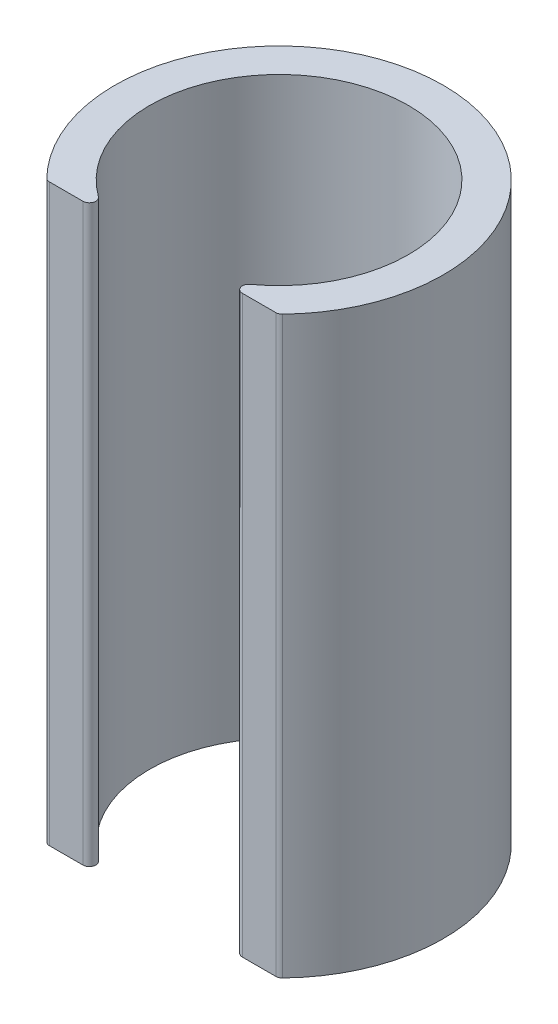
ISO-10303-21;
HEADER;
FILE_DESCRIPTION(('STEP AP214'),'2;1');
FILE_NAME('part.step','',(''),(''),'','','');
FILE_SCHEMA(('AUTOMOTIVE_DESIGN { 1 0 10303 214 1 1 1 1 }'));
ENDSEC;
DATA;
#1=APPLICATION_CONTEXT('core data for automotive mechanical design processes');
#2=APPLICATION_PROTOCOL_DEFINITION('international standard','automotive_design',2000,#1);
#3=PRODUCT_CONTEXT('',#1,'mechanical');
#4=PRODUCT('Part','Part','',(#3));
#5=PRODUCT_RELATED_PRODUCT_CATEGORY('part','',(#4));
#6=PRODUCT_DEFINITION_FORMATION('','',#4);
#7=PRODUCT_DEFINITION_CONTEXT('part definition',#1,'design');
#8=PRODUCT_DEFINITION('design','',#6,#7);
#9=PRODUCT_DEFINITION_SHAPE('','',#8);
#10=(LENGTH_UNIT() NAMED_UNIT(*) SI_UNIT(.MILLI.,.METRE.));
#11=(NAMED_UNIT(*) PLANE_ANGLE_UNIT() SI_UNIT($,.RADIAN.));
#12=(NAMED_UNIT(*) SI_UNIT($,.STERADIAN.) SOLID_ANGLE_UNIT());
#13=UNCERTAINTY_MEASURE_WITH_UNIT(LENGTH_MEASURE(1.E-05),#10,'distance_accuracy_value','');
#14=(GEOMETRIC_REPRESENTATION_CONTEXT(3) GLOBAL_UNCERTAINTY_ASSIGNED_CONTEXT((#13)) GLOBAL_UNIT_ASSIGNED_CONTEXT((#10,
#11,#12)) REPRESENTATION_CONTEXT('',''));
#15=CARTESIAN_POINT('',(0.,0.,0.));
#16=DIRECTION('',(0.,0.,1.));
#17=DIRECTION('',(1.,0.,0.));
#18=AXIS2_PLACEMENT_3D('',#15,#16,#17);
#19=CARTESIAN_POINT('',(0.,22.225,0.));
#20=DIRECTION('',(0.,-1.,0.));
#21=DIRECTION('',(0.,0.,-1.));
#22=AXIS2_PLACEMENT_3D('',#19,#20,#21);
#23=CYLINDRICAL_SURFACE('',#22,6.35);
#24=CARTESIAN_POINT('',(0.,22.225,0.));
#25=DIRECTION('',(0.,1.,0.));
#26=DIRECTION('',(0.,0.,-1.));
#27=AXIS2_PLACEMENT_3D('',#24,#25,#26);
#28=CIRCLE('',#27,6.35);
#29=CARTESIAN_POINT('',(4.55512112094709,22.225,4.42418032786885));
#30=VERTEX_POINT('',#29);
#31=CARTESIAN_POINT('',(-4.55512112094709,22.225,4.42418032786885));
#32=VERTEX_POINT('',#31);
#33=EDGE_CURVE('E125',#30,#32,#28,.T.);
#34=ORIENTED_EDGE('',*,*,#33,.F.);
#35=DIRECTION('',(0.,-1.,0.));
#36=VECTOR('',#35,1.);
#37=CARTESIAN_POINT('',(4.55512112094709,22.225,4.42418032786885));
#38=LINE('',#37,#36);
#39=CARTESIAN_POINT('',(4.55512112094709,0.,4.42418032786885));
#40=VERTEX_POINT('',#39);
#41=EDGE_CURVE('E110',#30,#40,#38,.T.);
#42=ORIENTED_EDGE('',*,*,#41,.T.);
#43=CARTESIAN_POINT('',(0.,0.,0.));
#44=DIRECTION('',(0.,1.,0.));
#45=DIRECTION('',(0.,0.,-1.));
#46=AXIS2_PLACEMENT_3D('',#43,#44,#45);
#47=CIRCLE('',#46,6.35);
#48=CARTESIAN_POINT('',(-4.55512112094709,0.,4.42418032786885));
#49=VERTEX_POINT('',#48);
#50=EDGE_CURVE('E122',#40,#49,#47,.T.);
#51=ORIENTED_EDGE('',*,*,#50,.T.);
#52=DIRECTION('',(0.,-1.,0.));
#53=VECTOR('',#52,1.);
#54=CARTESIAN_POINT('',(-4.55512112094709,22.225,4.42418032786885));
#55=LINE('',#54,#53);
#56=EDGE_CURVE('E127',#49,#32,#55,.F.);
#57=ORIENTED_EDGE('',*,*,#56,.T.);
#58=EDGE_LOOP('',(#34,#42,#51,#57));
#59=FACE_BOUND('',#58,.T.);
#60=ADVANCED_FACE('F39',(#59),#23,.T.);
#61=CARTESIAN_POINT('',(-2.17944947177034,22.225,4.5));
#62=DIRECTION('',(0.,0.,-1.));
#63=DIRECTION('',(-1.,0.,0.));
#64=AXIS2_PLACEMENT_3D('',#61,#62,#63);
#65=PLANE('',#64);
#66=DIRECTION('',(1.,0.,0.));
#67=VECTOR('',#66,1.);
#68=CARTESIAN_POINT('',(-2.17944947177034,22.225,4.5));
#69=LINE('',#68,#67);
#70=CARTESIAN_POINT('',(-4.37578564374445,22.225,4.5));
#71=VERTEX_POINT('',#70);
#72=CARTESIAN_POINT('',(-3.08220700148449,22.225,4.5));
#73=VERTEX_POINT('',#72);
#74=EDGE_CURVE('E165',#71,#73,#69,.T.);
#75=ORIENTED_EDGE('',*,*,#74,.F.);
#76=DIRECTION('',(0.,-1.,0.));
#77=VECTOR('',#76,1.);
#78=CARTESIAN_POINT('',(-4.37578564374445,22.225,4.5));
#79=LINE('',#78,#77);
#80=CARTESIAN_POINT('',(-4.37578564374445,0.,4.5));
#81=VERTEX_POINT('',#80);
#82=EDGE_CURVE('E11',#71,#81,#79,.T.);
#83=ORIENTED_EDGE('',*,*,#82,.T.);
#84=DIRECTION('',(1.,0.,0.));
#85=VECTOR('',#84,1.);
#86=CARTESIAN_POINT('',(-2.17944947177034,0.,4.5));
#87=LINE('',#86,#85);
#88=CARTESIAN_POINT('',(-3.08220700148449,0.,4.5));
#89=VERTEX_POINT('',#88);
#90=EDGE_CURVE('E132',#81,#89,#87,.T.);
#91=ORIENTED_EDGE('',*,*,#90,.T.);
#92=DIRECTION('',(0.,-1.,0.));
#93=VECTOR('',#92,1.);
#94=CARTESIAN_POINT('',(-3.08220700148449,22.225,4.5));
#95=LINE('',#94,#93);
#96=EDGE_CURVE('E47',#89,#73,#95,.F.);
#97=ORIENTED_EDGE('',*,*,#96,.T.);
#98=EDGE_LOOP('',(#75,#83,#91,#97));
#99=FACE_BOUND('',#98,.T.);
#100=ADVANCED_FACE('F164',(#99),#65,.F.);
#101=CARTESIAN_POINT('',(0.,22.225,0.));
#102=DIRECTION('',(0.,-1.,0.));
#103=DIRECTION('',(0.,0.,-1.));
#104=AXIS2_PLACEMENT_3D('',#101,#102,#103);
#105=CYLINDRICAL_SURFACE('',#104,5.);
#106=CARTESIAN_POINT('',(0.,0.,0.));
#107=DIRECTION('',(0.,-1.,0.));
#108=DIRECTION('',(0.,0.,1.));
#109=AXIS2_PLACEMENT_3D('',#106,#107,#108);
#110=CIRCLE('',#109,5.);
#111=CARTESIAN_POINT('',(-2.93543523950904,0.,4.04761904761905));
#112=VERTEX_POINT('',#111);
#113=CARTESIAN_POINT('',(2.93543523950904,0.,4.04761904761905));
#114=VERTEX_POINT('',#113);
#115=EDGE_CURVE('E135',#112,#114,#110,.T.);
#116=ORIENTED_EDGE('',*,*,#115,.T.);
#117=DIRECTION('',(0.,-1.,0.));
#118=VECTOR('',#117,1.);
#119=CARTESIAN_POINT('',(2.93543523950904,22.225,4.04761904761905));
#120=LINE('',#119,#118);
#121=CARTESIAN_POINT('',(2.93543523950904,22.225,4.04761904761905));
#122=VERTEX_POINT('',#121);
#123=EDGE_CURVE('E54',#114,#122,#120,.F.);
#124=ORIENTED_EDGE('',*,*,#123,.T.);
#125=CARTESIAN_POINT('',(0.,22.225,0.));
#126=DIRECTION('',(0.,-1.,0.));
#127=DIRECTION('',(0.,0.,1.));
#128=AXIS2_PLACEMENT_3D('',#125,#126,#127);
#129=CIRCLE('',#128,5.);
#130=CARTESIAN_POINT('',(-2.93543523950904,22.225,4.04761904761905));
#131=VERTEX_POINT('',#130);
#132=EDGE_CURVE('E171',#131,#122,#129,.T.);
#133=ORIENTED_EDGE('',*,*,#132,.F.);
#134=DIRECTION('',(0.,-1.,0.));
#135=VECTOR('',#134,1.);
#136=CARTESIAN_POINT('',(-2.93543523950904,22.225,4.04761904761905));
#137=LINE('',#136,#135);
#138=EDGE_CURVE('E158',#131,#112,#137,.T.);
#139=ORIENTED_EDGE('',*,*,#138,.T.);
#140=EDGE_LOOP('',(#116,#124,#133,#139));
#141=FACE_BOUND('',#140,.T.);
#142=ADVANCED_FACE('F175',(#141),#105,.F.);
#143=CARTESIAN_POINT('',(2.17944947177034,22.225,4.5));
#144=DIRECTION('',(0.,0.,-1.));
#145=DIRECTION('',(-1.,0.,0.));
#146=AXIS2_PLACEMENT_3D('',#143,#144,#145);
#147=PLANE('',#146);
#148=DIRECTION('',(1.,0.,0.));
#149=VECTOR('',#148,1.);
#150=CARTESIAN_POINT('',(2.17944947177034,0.,4.5));
#151=LINE('',#150,#149);
#152=CARTESIAN_POINT('',(3.08220700148449,0.,4.5));
#153=VERTEX_POINT('',#152);
#154=CARTESIAN_POINT('',(4.37578564374445,0.,4.5));
#155=VERTEX_POINT('',#154);
#156=EDGE_CURVE('E142',#153,#155,#151,.T.);
#157=ORIENTED_EDGE('',*,*,#156,.T.);
#158=DIRECTION('',(0.,-1.,0.));
#159=VECTOR('',#158,1.);
#160=CARTESIAN_POINT('',(4.37578564374445,22.225,4.5));
#161=LINE('',#160,#159);
#162=CARTESIAN_POINT('',(4.37578564374445,22.225,4.5));
#163=VERTEX_POINT('',#162);
#164=EDGE_CURVE('E111',#155,#163,#161,.F.);
#165=ORIENTED_EDGE('',*,*,#164,.T.);
#166=DIRECTION('',(1.,0.,0.));
#167=VECTOR('',#166,1.);
#168=CARTESIAN_POINT('',(2.17944947177034,22.225,4.5));
#169=LINE('',#168,#167);
#170=CARTESIAN_POINT('',(3.08220700148449,22.225,4.5));
#171=VERTEX_POINT('',#170);
#172=EDGE_CURVE('E138',#171,#163,#169,.T.);
#173=ORIENTED_EDGE('',*,*,#172,.F.);
#174=DIRECTION('',(0.,-1.,0.));
#175=VECTOR('',#174,1.);
#176=CARTESIAN_POINT('',(3.08220700148449,22.225,4.5));
#177=LINE('',#176,#175);
#178=EDGE_CURVE('E116',#171,#153,#177,.T.);
#179=ORIENTED_EDGE('',*,*,#178,.T.);
#180=EDGE_LOOP('',(#157,#165,#173,#179));
#181=FACE_BOUND('',#180,.T.);
#182=ADVANCED_FACE('F182',(#181),#147,.F.);
#183=CARTESIAN_POINT('',(0.,22.225,0.));
#184=DIRECTION('',(0.,-1.,0.));
#185=DIRECTION('',(0.,0.,-1.));
#186=AXIS2_PLACEMENT_3D('',#183,#184,#185);
#187=PLANE('',#186);
#188=ORIENTED_EDGE('',*,*,#172,.T.);
#189=CARTESIAN_POINT('',(4.37578564374445,22.225,4.25));
#190=DIRECTION('',(0.,-1.,0.));
#191=DIRECTION('',(0.,0.,-1.));
#192=AXIS2_PLACEMENT_3D('',#189,#190,#191);
#193=CIRCLE('',#192,0.25);
#194=EDGE_CURVE('E156',#163,#30,#193,.F.);
#195=ORIENTED_EDGE('',*,*,#194,.T.);
#196=ORIENTED_EDGE('',*,*,#33,.T.);
#197=CARTESIAN_POINT('',(-4.37578564374445,22.225,4.25));
#198=DIRECTION('',(0.,-1.,0.));
#199=DIRECTION('',(0.,0.,-1.));
#200=AXIS2_PLACEMENT_3D('',#197,#198,#199);
#201=CIRCLE('',#200,0.25);
#202=EDGE_CURVE('E152',#32,#71,#201,.F.);
#203=ORIENTED_EDGE('',*,*,#202,.T.);
#204=ORIENTED_EDGE('',*,*,#74,.T.);
#205=CARTESIAN_POINT('',(-3.08220700148449,22.225,4.25));
#206=DIRECTION('',(0.,-1.,0.));
#207=DIRECTION('',(0.,0.,-1.));
#208=AXIS2_PLACEMENT_3D('',#205,#206,#207);
#209=CIRCLE('',#208,0.25);
#210=EDGE_CURVE('E61',#73,#131,#209,.F.);
#211=ORIENTED_EDGE('',*,*,#210,.T.);
#212=ORIENTED_EDGE('',*,*,#132,.T.);
#213=CARTESIAN_POINT('',(3.08220700148449,22.225,4.25));
#214=DIRECTION('',(0.,-1.,0.));
#215=DIRECTION('',(0.,0.,-1.));
#216=AXIS2_PLACEMENT_3D('',#213,#214,#215);
#217=CIRCLE('',#216,0.25);
#218=EDGE_CURVE('E154',#122,#171,#217,.F.);
#219=ORIENTED_EDGE('',*,*,#218,.T.);
#220=EDGE_LOOP('',(#188,#195,#196,#203,#204,#211,#212,#219));
#221=FACE_BOUND('',#220,.T.);
#222=ADVANCED_FACE('F169',(#221),#187,.F.);
#223=CARTESIAN_POINT('',(0.,0.,0.));
#224=DIRECTION('',(0.,-1.,0.));
#225=DIRECTION('',(0.,0.,-1.));
#226=AXIS2_PLACEMENT_3D('',#223,#224,#225);
#227=PLANE('',#226);
#228=ORIENTED_EDGE('',*,*,#50,.F.);
#229=CARTESIAN_POINT('',(4.37578564374445,0.,4.25));
#230=DIRECTION('',(0.,-1.,0.));
#231=DIRECTION('',(0.,0.,-1.));
#232=AXIS2_PLACEMENT_3D('',#229,#230,#231);
#233=CIRCLE('',#232,0.25);
#234=EDGE_CURVE('E106',#40,#155,#233,.T.);
#235=ORIENTED_EDGE('',*,*,#234,.T.);
#236=ORIENTED_EDGE('',*,*,#156,.F.);
#237=CARTESIAN_POINT('',(3.08220700148449,0.,4.25));
#238=DIRECTION('',(0.,-1.,0.));
#239=DIRECTION('',(0.,0.,-1.));
#240=AXIS2_PLACEMENT_3D('',#237,#238,#239);
#241=CIRCLE('',#240,0.25);
#242=EDGE_CURVE('E117',#153,#114,#241,.T.);
#243=ORIENTED_EDGE('',*,*,#242,.T.);
#244=ORIENTED_EDGE('',*,*,#115,.F.);
#245=CARTESIAN_POINT('',(-3.08220700148449,0.,4.25));
#246=DIRECTION('',(0.,-1.,0.));
#247=DIRECTION('',(0.,0.,-1.));
#248=AXIS2_PLACEMENT_3D('',#245,#246,#247);
#249=CIRCLE('',#248,0.25);
#250=EDGE_CURVE('E126',#112,#89,#249,.T.);
#251=ORIENTED_EDGE('',*,*,#250,.T.);
#252=ORIENTED_EDGE('',*,*,#90,.F.);
#253=CARTESIAN_POINT('',(-4.37578564374445,0.,4.25));
#254=DIRECTION('',(0.,-1.,0.));
#255=DIRECTION('',(0.,0.,-1.));
#256=AXIS2_PLACEMENT_3D('',#253,#254,#255);
#257=CIRCLE('',#256,0.25);
#258=EDGE_CURVE('E131',#81,#49,#257,.T.);
#259=ORIENTED_EDGE('',*,*,#258,.T.);
#260=EDGE_LOOP('',(#228,#235,#236,#243,#244,#251,#252,#259));
#261=FACE_BOUND('',#260,.T.);
#262=ADVANCED_FACE('F129',(#261),#227,.T.);
#263=CARTESIAN_POINT('',(4.37578564374445,22.225,4.25));
#264=DIRECTION('',(0.,-1.,0.));
#265=DIRECTION('',(0.,0.,-1.));
#266=AXIS2_PLACEMENT_3D('',#263,#264,#265);
#267=CYLINDRICAL_SURFACE('',#266,0.25);
#268=ORIENTED_EDGE('',*,*,#194,.F.);
#269=ORIENTED_EDGE('',*,*,#164,.F.);
#270=ORIENTED_EDGE('',*,*,#234,.F.);
#271=ORIENTED_EDGE('',*,*,#41,.F.);
#272=EDGE_LOOP('',(#268,#269,#270,#271));
#273=FACE_BOUND('',#272,.T.);
#274=ADVANCED_FACE('F109',(#273),#267,.T.);
#275=CARTESIAN_POINT('',(3.08220700148449,22.225,4.25));
#276=DIRECTION('',(0.,-1.,0.));
#277=DIRECTION('',(0.,0.,-1.));
#278=AXIS2_PLACEMENT_3D('',#275,#276,#277);
#279=CYLINDRICAL_SURFACE('',#278,0.25);
#280=ORIENTED_EDGE('',*,*,#218,.F.);
#281=ORIENTED_EDGE('',*,*,#123,.F.);
#282=ORIENTED_EDGE('',*,*,#242,.F.);
#283=ORIENTED_EDGE('',*,*,#178,.F.);
#284=EDGE_LOOP('',(#280,#281,#282,#283));
#285=FACE_BOUND('',#284,.T.);
#286=ADVANCED_FACE('F179',(#285),#279,.T.);
#287=CARTESIAN_POINT('',(-4.37578564374445,22.225,4.25));
#288=DIRECTION('',(0.,-1.,0.));
#289=DIRECTION('',(0.,0.,-1.));
#290=AXIS2_PLACEMENT_3D('',#287,#288,#289);
#291=CYLINDRICAL_SURFACE('',#290,0.25);
#292=ORIENTED_EDGE('',*,*,#202,.F.);
#293=ORIENTED_EDGE('',*,*,#56,.F.);
#294=ORIENTED_EDGE('',*,*,#258,.F.);
#295=ORIENTED_EDGE('',*,*,#82,.F.);
#296=EDGE_LOOP('',(#292,#293,#294,#295));
#297=FACE_BOUND('',#296,.T.);
#298=ADVANCED_FACE('F185',(#297),#291,.T.);
#299=CARTESIAN_POINT('',(-3.08220700148449,22.225,4.25));
#300=DIRECTION('',(0.,-1.,0.));
#301=DIRECTION('',(0.,0.,-1.));
#302=AXIS2_PLACEMENT_3D('',#299,#300,#301);
#303=CYLINDRICAL_SURFACE('',#302,0.25);
#304=ORIENTED_EDGE('',*,*,#210,.F.);
#305=ORIENTED_EDGE('',*,*,#96,.F.);
#306=ORIENTED_EDGE('',*,*,#250,.F.);
#307=ORIENTED_EDGE('',*,*,#138,.F.);
#308=EDGE_LOOP('',(#304,#305,#306,#307));
#309=FACE_BOUND('',#308,.T.);
#310=ADVANCED_FACE('F41',(#309),#303,.T.);
#311=CLOSED_SHELL('',(#60,#100,#142,#182,#222,#262,#274,#286,#298,#310));
#312=MANIFOLD_SOLID_BREP('B2',#311);
#313=ADVANCED_BREP_SHAPE_REPRESENTATION('',(#18,#312),#14);
#314=SHAPE_DEFINITION_REPRESENTATION(#9,#313);
ENDSEC;
END-ISO-10303-21;
